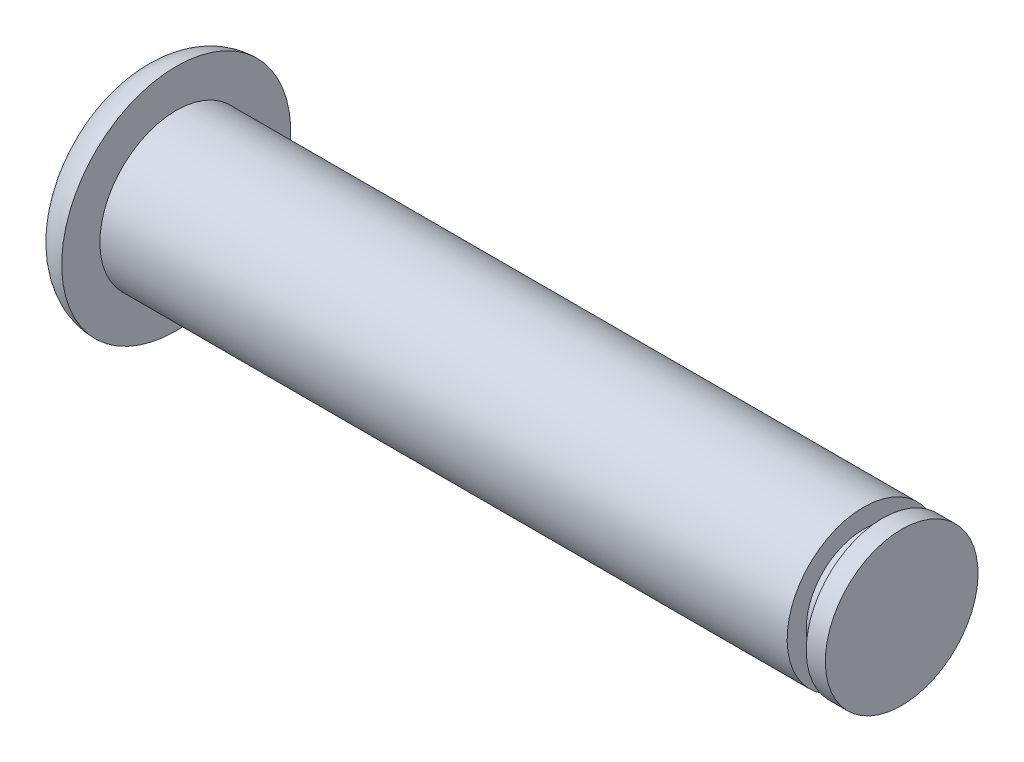
ISO-10303-21;
HEADER;
FILE_DESCRIPTION(('STEP AP214'),'2;1');
FILE_NAME('part.step','',(''),(''),'','','');
FILE_SCHEMA(('AUTOMOTIVE_DESIGN { 1 0 10303 214 1 1 1 1 }'));
ENDSEC;
DATA;
#1=APPLICATION_CONTEXT('core data for automotive mechanical design processes');
#2=APPLICATION_PROTOCOL_DEFINITION('international standard','automotive_design',2000,#1);
#3=PRODUCT_CONTEXT('',#1,'mechanical');
#4=PRODUCT('Part','Part','',(#3));
#5=PRODUCT_RELATED_PRODUCT_CATEGORY('part','',(#4));
#6=PRODUCT_DEFINITION_FORMATION('','',#4);
#7=PRODUCT_DEFINITION_CONTEXT('part definition',#1,'design');
#8=PRODUCT_DEFINITION('design','',#6,#7);
#9=PRODUCT_DEFINITION_SHAPE('','',#8);
#10=(LENGTH_UNIT() NAMED_UNIT(*) SI_UNIT(.MILLI.,.METRE.));
#11=(NAMED_UNIT(*) PLANE_ANGLE_UNIT() SI_UNIT($,.RADIAN.));
#12=(NAMED_UNIT(*) SI_UNIT($,.STERADIAN.) SOLID_ANGLE_UNIT());
#13=UNCERTAINTY_MEASURE_WITH_UNIT(LENGTH_MEASURE(1.E-05),#10,'distance_accuracy_value','');
#14=(GEOMETRIC_REPRESENTATION_CONTEXT(3) GLOBAL_UNCERTAINTY_ASSIGNED_CONTEXT((#13)) GLOBAL_UNIT_ASSIGNED_CONTEXT((#10,
#11,#12)) REPRESENTATION_CONTEXT('',''));
#15=CARTESIAN_POINT('',(0.,0.,0.));
#16=DIRECTION('',(0.,0.,1.));
#17=DIRECTION('',(1.,0.,0.));
#18=AXIS2_PLACEMENT_3D('',#15,#16,#17);
#19=CARTESIAN_POINT('',(-19.,0.,0.));
#20=DIRECTION('',(1.,0.,0.));
#21=DIRECTION('',(0.,1.,0.));
#22=AXIS2_PLACEMENT_3D('',#19,#20,#21);
#23=TOROIDAL_SURFACE('',#22,2.,1.);
#24=CARTESIAN_POINT('',(-19.,0.,0.));
#25=DIRECTION('',(1.,0.,0.));
#26=DIRECTION('',(0.,1.,0.));
#27=AXIS2_PLACEMENT_3D('',#24,#25,#26);
#28=CIRCLE('',#27,3.);
#29=CARTESIAN_POINT('',(-19.,3.,0.));
#30=VERTEX_POINT('',#29);
#31=EDGE_CURVE('E67',#30,#30,#28,.T.);
#32=ORIENTED_EDGE('',*,*,#31,.F.);
#33=EDGE_LOOP('',(#32));
#34=FACE_BOUND('',#33,.T.);
#35=CARTESIAN_POINT('',(-20.,0.,0.));
#36=DIRECTION('',(1.,0.,0.));
#37=DIRECTION('',(0.,1.,0.));
#38=AXIS2_PLACEMENT_3D('',#35,#36,#37);
#39=CIRCLE('',#38,2.);
#40=CARTESIAN_POINT('',(-20.,2.,0.));
#41=VERTEX_POINT('',#40);
#42=EDGE_CURVE('E10',#41,#41,#39,.T.);
#43=ORIENTED_EDGE('',*,*,#42,.T.);
#44=EDGE_LOOP('',(#43));
#45=FACE_BOUND('',#44,.T.);
#46=ADVANCED_FACE('F39',(#34,#45),#23,.T.);
#47=CARTESIAN_POINT('',(-20.,0.,0.));
#48=DIRECTION('',(-1.,0.,0.));
#49=DIRECTION('',(0.,-1.,0.));
#50=AXIS2_PLACEMENT_3D('',#47,#48,#49);
#51=PLANE('',#50);
#52=ORIENTED_EDGE('',*,*,#42,.F.);
#53=EDGE_LOOP('',(#52));
#54=FACE_BOUND('',#53,.T.);
#55=ADVANCED_FACE('F75',(#54),#51,.T.);
#56=CARTESIAN_POINT('',(0.,0.,0.));
#57=DIRECTION('',(1.,0.,0.));
#58=DIRECTION('',(0.,1.,0.));
#59=AXIS2_PLACEMENT_3D('',#56,#57,#58);
#60=PLANE('',#59);
#61=CARTESIAN_POINT('',(0.,0.,0.));
#62=DIRECTION('',(1.,0.,0.));
#63=DIRECTION('',(0.,1.,0.));
#64=AXIS2_PLACEMENT_3D('',#61,#62,#63);
#65=CIRCLE('',#64,2.);
#66=CARTESIAN_POINT('',(0.,2.,0.));
#67=VERTEX_POINT('',#66);
#68=EDGE_CURVE('E45',#67,#67,#65,.T.);
#69=ORIENTED_EDGE('',*,*,#68,.T.);
#70=EDGE_LOOP('',(#69));
#71=FACE_BOUND('',#70,.T.);
#72=ADVANCED_FACE('F79',(#71),#60,.T.);
#73=CARTESIAN_POINT('',(0.,0.,0.));
#74=DIRECTION('',(1.,0.,0.));
#75=DIRECTION('',(0.,1.,0.));
#76=AXIS2_PLACEMENT_3D('',#73,#74,#75);
#77=CYLINDRICAL_SURFACE('',#76,2.);
#78=CARTESIAN_POINT('',(-0.5,0.,0.));
#79=DIRECTION('',(1.,0.,0.));
#80=DIRECTION('',(0.,1.,0.));
#81=AXIS2_PLACEMENT_3D('',#78,#79,#80);
#82=CIRCLE('',#81,2.);
#83=CARTESIAN_POINT('',(-0.5,2.,0.));
#84=VERTEX_POINT('',#83);
#85=EDGE_CURVE('E49',#84,#84,#82,.T.);
#86=ORIENTED_EDGE('',*,*,#85,.T.);
#87=EDGE_LOOP('',(#86));
#88=FACE_BOUND('',#87,.T.);
#89=ORIENTED_EDGE('',*,*,#68,.F.);
#90=EDGE_LOOP('',(#89));
#91=FACE_BOUND('',#90,.T.);
#92=ADVANCED_FACE('F84',(#88,#91),#77,.T.);
#93=CARTESIAN_POINT('',(-0.5,0.,0.));
#94=DIRECTION('',(1.,0.,0.));
#95=DIRECTION('',(0.,1.,0.));
#96=AXIS2_PLACEMENT_3D('',#93,#94,#95);
#97=PLANE('',#96);
#98=ORIENTED_EDGE('',*,*,#85,.F.);
#99=EDGE_LOOP('',(#98));
#100=FACE_BOUND('',#99,.T.);
#101=CARTESIAN_POINT('',(-0.5,0.,0.));
#102=DIRECTION('',(1.,0.,0.));
#103=DIRECTION('',(0.,1.,0.));
#104=AXIS2_PLACEMENT_3D('',#101,#102,#103);
#105=CIRCLE('',#104,1.5);
#106=CARTESIAN_POINT('',(-0.5,1.5,0.));
#107=VERTEX_POINT('',#106);
#108=EDGE_CURVE('E53',#107,#107,#105,.T.);
#109=ORIENTED_EDGE('',*,*,#108,.T.);
#110=EDGE_LOOP('',(#109));
#111=FACE_BOUND('',#110,.T.);
#112=ADVANCED_FACE('F89',(#100,#111),#97,.F.);
#113=CARTESIAN_POINT('',(0.,0.,0.));
#114=DIRECTION('',(1.,0.,0.));
#115=DIRECTION('',(0.,1.,0.));
#116=AXIS2_PLACEMENT_3D('',#113,#114,#115);
#117=CYLINDRICAL_SURFACE('',#116,1.5);
#118=ORIENTED_EDGE('',*,*,#108,.F.);
#119=EDGE_LOOP('',(#118));
#120=FACE_BOUND('',#119,.T.);
#121=CARTESIAN_POINT('',(-1.,0.,0.));
#122=DIRECTION('',(1.,0.,0.));
#123=DIRECTION('',(0.,1.,0.));
#124=AXIS2_PLACEMENT_3D('',#121,#122,#123);
#125=CIRCLE('',#124,1.5);
#126=CARTESIAN_POINT('',(-1.,1.5,0.));
#127=VERTEX_POINT('',#126);
#128=EDGE_CURVE('E58',#127,#127,#125,.T.);
#129=ORIENTED_EDGE('',*,*,#128,.T.);
#130=EDGE_LOOP('',(#129));
#131=FACE_BOUND('',#130,.T.);
#132=ADVANCED_FACE('F93',(#120,#131),#117,.T.);
#133=CARTESIAN_POINT('',(-1.,0.,0.));
#134=DIRECTION('',(-1.,0.,0.));
#135=DIRECTION('',(0.,-1.,0.));
#136=AXIS2_PLACEMENT_3D('',#133,#134,#135);
#137=PLANE('',#136);
#138=ORIENTED_EDGE('',*,*,#128,.F.);
#139=EDGE_LOOP('',(#138));
#140=FACE_BOUND('',#139,.T.);
#141=CARTESIAN_POINT('',(-1.,0.,0.));
#142=DIRECTION('',(1.,0.,0.));
#143=DIRECTION('',(0.,1.,0.));
#144=AXIS2_PLACEMENT_3D('',#141,#142,#143);
#145=CIRCLE('',#144,2.);
#146=CARTESIAN_POINT('',(-1.,2.,0.));
#147=VERTEX_POINT('',#146);
#148=EDGE_CURVE('E61',#147,#147,#145,.T.);
#149=ORIENTED_EDGE('',*,*,#148,.T.);
#150=EDGE_LOOP('',(#149));
#151=FACE_BOUND('',#150,.T.);
#152=ADVANCED_FACE('F97',(#140,#151),#137,.F.);
#153=CARTESIAN_POINT('',(0.,0.,0.));
#154=DIRECTION('',(1.,0.,0.));
#155=DIRECTION('',(0.,1.,0.));
#156=AXIS2_PLACEMENT_3D('',#153,#154,#155);
#157=CYLINDRICAL_SURFACE('',#156,2.);
#158=CARTESIAN_POINT('',(-19.,0.,0.));
#159=DIRECTION('',(1.,0.,0.));
#160=DIRECTION('',(0.,1.,0.));
#161=AXIS2_PLACEMENT_3D('',#158,#159,#160);
#162=CIRCLE('',#161,2.);
#163=CARTESIAN_POINT('',(-19.,2.,0.));
#164=VERTEX_POINT('',#163);
#165=EDGE_CURVE('E64',#164,#164,#162,.T.);
#166=ORIENTED_EDGE('',*,*,#165,.T.);
#167=EDGE_LOOP('',(#166));
#168=FACE_BOUND('',#167,.T.);
#169=ORIENTED_EDGE('',*,*,#148,.F.);
#170=EDGE_LOOP('',(#169));
#171=FACE_BOUND('',#170,.T.);
#172=ADVANCED_FACE('F101',(#168,#171),#157,.T.);
#173=CARTESIAN_POINT('',(-19.,0.,0.));
#174=DIRECTION('',(1.,0.,0.));
#175=DIRECTION('',(0.,1.,0.));
#176=AXIS2_PLACEMENT_3D('',#173,#174,#175);
#177=PLANE('',#176);
#178=ORIENTED_EDGE('',*,*,#31,.T.);
#179=EDGE_LOOP('',(#178));
#180=FACE_BOUND('',#179,.T.);
#181=ORIENTED_EDGE('',*,*,#165,.F.);
#182=EDGE_LOOP('',(#181));
#183=FACE_BOUND('',#182,.T.);
#184=ADVANCED_FACE('F71',(#180,#183),#177,.T.);
#185=CLOSED_SHELL('',(#46,#55,#72,#92,#112,#132,#152,#172,#184));
#186=MANIFOLD_SOLID_BREP('B2',#185);
#187=ADVANCED_BREP_SHAPE_REPRESENTATION('',(#18,#186),#14);
#188=SHAPE_DEFINITION_REPRESENTATION(#9,#187);
ENDSEC;
END-ISO-10303-21;
